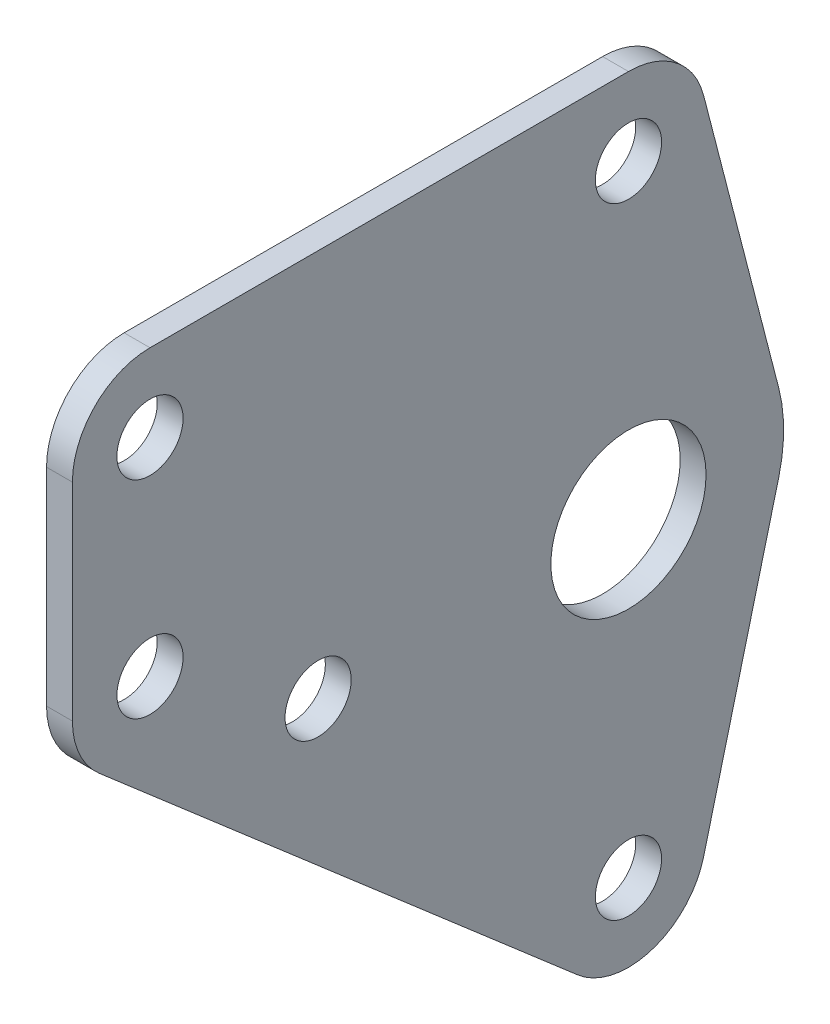
ISO-10303-21;
HEADER;
FILE_DESCRIPTION(('STEP AP214'),'2;1');
FILE_NAME('part.step','',(''),(''),'','','');
FILE_SCHEMA(('AUTOMOTIVE_DESIGN { 1 0 10303 214 1 1 1 1 }'));
ENDSEC;
DATA;
#1=APPLICATION_CONTEXT('core data for automotive mechanical design processes');
#2=APPLICATION_PROTOCOL_DEFINITION('international standard','automotive_design',2000,#1);
#3=PRODUCT_CONTEXT('',#1,'mechanical');
#4=PRODUCT('Part','Part','',(#3));
#5=PRODUCT_RELATED_PRODUCT_CATEGORY('part','',(#4));
#6=PRODUCT_DEFINITION_FORMATION('','',#4);
#7=PRODUCT_DEFINITION_CONTEXT('part definition',#1,'design');
#8=PRODUCT_DEFINITION('design','',#6,#7);
#9=PRODUCT_DEFINITION_SHAPE('','',#8);
#10=(LENGTH_UNIT() NAMED_UNIT(*) SI_UNIT(.MILLI.,.METRE.));
#11=(NAMED_UNIT(*) PLANE_ANGLE_UNIT() SI_UNIT($,.RADIAN.));
#12=(NAMED_UNIT(*) SI_UNIT($,.STERADIAN.) SOLID_ANGLE_UNIT());
#13=UNCERTAINTY_MEASURE_WITH_UNIT(LENGTH_MEASURE(1.E-05),#10,'distance_accuracy_value','');
#14=(GEOMETRIC_REPRESENTATION_CONTEXT(3) GLOBAL_UNCERTAINTY_ASSIGNED_CONTEXT((#13)) GLOBAL_UNIT_ASSIGNED_CONTEXT((#10,
#11,#12)) REPRESENTATION_CONTEXT('',''));
#15=CARTESIAN_POINT('',(0.,0.,0.));
#16=DIRECTION('',(0.,0.,1.));
#17=DIRECTION('',(1.,0.,0.));
#18=AXIS2_PLACEMENT_3D('',#15,#16,#17);
#19=CARTESIAN_POINT('',(1.5875,-19.05,0.));
#20=DIRECTION('',(-1.,0.,0.));
#21=DIRECTION('',(0.,0.,1.));
#22=AXIS2_PLACEMENT_3D('',#19,#20,#21);
#23=CYLINDRICAL_SURFACE('',#22,4.7625);
#24=DIRECTION('',(1.,0.,0.));
#25=VECTOR('',#24,1.);
#26=CARTESIAN_POINT('',(-57.6533492323841,-22.6521796088033,3.11539858058667));
#27=LINE('',#26,#25);
#28=CARTESIAN_POINT('',(0.,-22.6521796088033,3.11539858058667));
#29=VERTEX_POINT('',#28);
#30=CARTESIAN_POINT('',(1.5875,-22.6521796088033,3.11539858058667));
#31=VERTEX_POINT('',#30);
#32=EDGE_CURVE('E173',#29,#31,#27,.T.);
#33=ORIENTED_EDGE('',*,*,#32,.F.);
#34=CARTESIAN_POINT('',(0.,-19.05,0.));
#35=DIRECTION('',(1.,0.,0.));
#36=DIRECTION('',(0.,0.,1.));
#37=AXIS2_PLACEMENT_3D('',#34,#35,#36);
#38=CIRCLE('',#37,4.7625);
#39=CARTESIAN_POINT('',(0.,-20.240625,-4.61127079657821));
#40=VERTEX_POINT('',#39);
#41=EDGE_CURVE('E214',#29,#40,#38,.T.);
#42=ORIENTED_EDGE('',*,*,#41,.T.);
#43=DIRECTION('',(-1.,0.,0.));
#44=VECTOR('',#43,1.);
#45=CARTESIAN_POINT('',(1.5875,-20.240625,-4.61127079657821));
#46=LINE('',#45,#44);
#47=CARTESIAN_POINT('',(1.5875,-20.240625,-4.61127079657821));
#48=VERTEX_POINT('',#47);
#49=EDGE_CURVE('E11',#48,#40,#46,.T.);
#50=ORIENTED_EDGE('',*,*,#49,.F.);
#51=CARTESIAN_POINT('',(1.5875,-19.05,0.));
#52=DIRECTION('',(1.,0.,0.));
#53=DIRECTION('',(0.,0.,1.));
#54=AXIS2_PLACEMENT_3D('',#51,#52,#53);
#55=CIRCLE('',#54,4.7625);
#56=EDGE_CURVE('E99',#31,#48,#55,.T.);
#57=ORIENTED_EDGE('',*,*,#56,.F.);
#58=EDGE_LOOP('',(#33,#42,#50,#57));
#59=FACE_BOUND('',#58,.T.);
#60=ADVANCED_FACE('F44',(#59),#23,.T.);
#61=CARTESIAN_POINT('',(1.5875,-19.05,0.));
#62=DIRECTION('',(-1.,0.,0.));
#63=DIRECTION('',(0.,0.,1.));
#64=AXIS2_PLACEMENT_3D('',#61,#62,#63);
#65=PLANE('',#64);
#66=DIRECTION('',(0.,-0.654151932931584,-0.756363172452144));
#67=VECTOR('',#66,1.);
#68=CARTESIAN_POINT('',(1.5875,-22.6521796088033,3.11539858058667));
#69=LINE('',#68,#67);
#70=CARTESIAN_POINT('',(1.5875,2.74782039119666,32.4841485805867));
#71=VERTEX_POINT('',#70);
#72=EDGE_CURVE('E290',#71,#31,#69,.T.);
#73=ORIENTED_EDGE('',*,*,#72,.T.);
#74=ORIENTED_EDGE('',*,*,#56,.T.);
#75=DIRECTION('',(0.,0.968245836551854,-0.25));
#76=VECTOR('',#75,1.);
#77=CARTESIAN_POINT('',(1.5875,-2.38125,-9.22254159315641));
#78=LINE('',#77,#76);
#79=CARTESIAN_POINT('',(1.5875,-2.38125,-9.22254159315642));
#80=VERTEX_POINT('',#79);
#81=EDGE_CURVE('E219',#48,#80,#78,.T.);
#82=ORIENTED_EDGE('',*,*,#81,.T.);
#83=CARTESIAN_POINT('',(1.5875,0.,0.));
#84=DIRECTION('',(1.,0.,0.));
#85=DIRECTION('',(0.,0.,1.));
#86=AXIS2_PLACEMENT_3D('',#83,#84,#85);
#87=CIRCLE('',#86,9.525);
#88=CARTESIAN_POINT('',(1.5875,2.38125,-9.22254159315642));
#89=VERTEX_POINT('',#88);
#90=EDGE_CURVE('E221',#80,#89,#87,.T.);
#91=ORIENTED_EDGE('',*,*,#90,.T.);
#92=DIRECTION('',(0.,0.968245836551854,0.25));
#93=VECTOR('',#92,1.);
#94=CARTESIAN_POINT('',(1.5875,20.240625,-4.61127079657821));
#95=LINE('',#94,#93);
#96=CARTESIAN_POINT('',(1.5875,20.240625,-4.61127079657821));
#97=VERTEX_POINT('',#96);
#98=EDGE_CURVE('E72',#89,#97,#95,.T.);
#99=ORIENTED_EDGE('',*,*,#98,.T.);
#100=CARTESIAN_POINT('',(1.5875,19.05,0.));
#101=DIRECTION('',(1.,0.,0.));
#102=DIRECTION('',(0.,0.,1.));
#103=AXIS2_PLACEMENT_3D('',#100,#101,#102);
#104=CIRCLE('',#103,4.7625);
#105=CARTESIAN_POINT('',(1.5875,23.8125,0.));
#106=VERTEX_POINT('',#105);
#107=EDGE_CURVE('E229',#97,#106,#104,.T.);
#108=ORIENTED_EDGE('',*,*,#107,.T.);
#109=DIRECTION('',(0.,0.,1.));
#110=VECTOR('',#109,1.);
#111=CARTESIAN_POINT('',(1.5875,23.8125,29.36875));
#112=LINE('',#111,#110);
#113=CARTESIAN_POINT('',(1.5875,23.8125,29.36875));
#114=VERTEX_POINT('',#113);
#115=EDGE_CURVE('E56',#106,#114,#112,.T.);
#116=ORIENTED_EDGE('',*,*,#115,.T.);
#117=CARTESIAN_POINT('',(1.5875,19.05,29.36875));
#118=DIRECTION('',(1.,0.,0.));
#119=DIRECTION('',(0.,0.,-1.));
#120=AXIS2_PLACEMENT_3D('',#117,#118,#119);
#121=CIRCLE('',#120,4.7625);
#122=CARTESIAN_POINT('',(1.5875,19.05,34.13125));
#123=VERTEX_POINT('',#122);
#124=EDGE_CURVE('E160',#114,#123,#121,.T.);
#125=ORIENTED_EDGE('',*,*,#124,.T.);
#126=DIRECTION('',(0.,-1.,0.));
#127=VECTOR('',#126,1.);
#128=CARTESIAN_POINT('',(1.5875,6.35,34.13125));
#129=LINE('',#128,#127);
#130=CARTESIAN_POINT('',(1.5875,6.35,34.13125));
#131=VERTEX_POINT('',#130);
#132=EDGE_CURVE('E300',#123,#131,#129,.T.);
#133=ORIENTED_EDGE('',*,*,#132,.T.);
#134=CARTESIAN_POINT('',(1.5875,6.35,29.36875));
#135=DIRECTION('',(1.,0.,0.));
#136=DIRECTION('',(0.,0.,-1.));
#137=AXIS2_PLACEMENT_3D('',#134,#135,#136);
#138=CIRCLE('',#137,4.7625);
#139=EDGE_CURVE('E295',#131,#71,#138,.T.);
#140=ORIENTED_EDGE('',*,*,#139,.T.);
#141=EDGE_LOOP('',(#73,#74,#82,#91,#99,#108,#116,#125,#133,#140));
#142=FACE_BOUND('',#141,.T.);
#143=CARTESIAN_POINT('',(1.5875,0.,0.));
#144=DIRECTION('',(1.,0.,0.));
#145=DIRECTION('',(0.,0.,-1.));
#146=AXIS2_PLACEMENT_3D('',#143,#144,#145);
#147=CIRCLE('',#146,4.7625);
#148=CARTESIAN_POINT('',(1.5875,0.,-4.7625));
#149=VERTEX_POINT('',#148);
#150=EDGE_CURVE('E211',#149,#149,#147,.T.);
#151=ORIENTED_EDGE('',*,*,#150,.F.);
#152=EDGE_LOOP('',(#151));
#153=FACE_BOUND('',#152,.T.);
#154=CARTESIAN_POINT('',(1.5875,19.05,0.));
#155=DIRECTION('',(1.,0.,0.));
#156=DIRECTION('',(0.,0.,-1.));
#157=AXIS2_PLACEMENT_3D('',#154,#155,#156);
#158=CIRCLE('',#157,2.032);
#159=CARTESIAN_POINT('',(1.5875,19.05,-2.032));
#160=VERTEX_POINT('',#159);
#161=EDGE_CURVE('E204',#160,#160,#158,.T.);
#162=ORIENTED_EDGE('',*,*,#161,.F.);
#163=EDGE_LOOP('',(#162));
#164=FACE_BOUND('',#163,.T.);
#165=CARTESIAN_POINT('',(1.5875,0.,19.05));
#166=DIRECTION('',(1.,0.,0.));
#167=DIRECTION('',(0.,0.,-1.));
#168=AXIS2_PLACEMENT_3D('',#165,#166,#167);
#169=CIRCLE('',#168,2.032);
#170=CARTESIAN_POINT('',(1.5875,0.,17.018));
#171=VERTEX_POINT('',#170);
#172=EDGE_CURVE('E198',#171,#171,#169,.T.);
#173=ORIENTED_EDGE('',*,*,#172,.F.);
#174=EDGE_LOOP('',(#173));
#175=FACE_BOUND('',#174,.T.);
#176=CARTESIAN_POINT('',(1.5875,-19.05,0.));
#177=DIRECTION('',(1.,0.,0.));
#178=DIRECTION('',(0.,0.,-1.));
#179=AXIS2_PLACEMENT_3D('',#176,#177,#178);
#180=CIRCLE('',#179,2.032);
#181=CARTESIAN_POINT('',(1.5875,-19.05,-2.032));
#182=VERTEX_POINT('',#181);
#183=EDGE_CURVE('E189',#182,#182,#180,.T.);
#184=ORIENTED_EDGE('',*,*,#183,.F.);
#185=EDGE_LOOP('',(#184));
#186=FACE_BOUND('',#185,.T.);
#187=CARTESIAN_POINT('',(1.5875,19.05,29.36875));
#188=DIRECTION('',(1.,0.,0.));
#189=DIRECTION('',(0.,0.,-1.));
#190=AXIS2_PLACEMENT_3D('',#187,#188,#189);
#191=CIRCLE('',#190,2.032);
#192=CARTESIAN_POINT('',(1.5875,19.05,27.33675));
#193=VERTEX_POINT('',#192);
#194=EDGE_CURVE('E303',#193,#193,#191,.T.);
#195=ORIENTED_EDGE('',*,*,#194,.F.);
#196=EDGE_LOOP('',(#195));
#197=FACE_BOUND('',#196,.T.);
#198=CARTESIAN_POINT('',(1.5875,6.35,29.36875));
#199=DIRECTION('',(1.,0.,0.));
#200=DIRECTION('',(0.,0.,-1.));
#201=AXIS2_PLACEMENT_3D('',#198,#199,#200);
#202=CIRCLE('',#201,2.032);
#203=CARTESIAN_POINT('',(1.5875,6.35,27.33675));
#204=VERTEX_POINT('',#203);
#205=EDGE_CURVE('E158',#204,#204,#202,.T.);
#206=ORIENTED_EDGE('',*,*,#205,.F.);
#207=EDGE_LOOP('',(#206));
#208=FACE_BOUND('',#207,.T.);
#209=ADVANCED_FACE('F275',(#142,#153,#164,#175,#186,#197,#208),#65,.F.);
#210=CARTESIAN_POINT('',(0.,-19.05,0.));
#211=DIRECTION('',(-1.,0.,0.));
#212=DIRECTION('',(0.,0.,1.));
#213=AXIS2_PLACEMENT_3D('',#210,#211,#212);
#214=PLANE('',#213);
#215=ORIENTED_EDGE('',*,*,#41,.F.);
#216=DIRECTION('',(0.,-0.654151932931584,-0.756363172452144));
#217=VECTOR('',#216,1.);
#218=CARTESIAN_POINT('',(0.,-22.6521796088033,3.11539858058667));
#219=LINE('',#218,#217);
#220=CARTESIAN_POINT('',(0.,2.74782039119666,32.4841485805867));
#221=VERTEX_POINT('',#220);
#222=EDGE_CURVE('E175',#221,#29,#219,.T.);
#223=ORIENTED_EDGE('',*,*,#222,.F.);
#224=CARTESIAN_POINT('',(0.,6.35,29.36875));
#225=DIRECTION('',(-1.,0.,0.));
#226=DIRECTION('',(0.,0.,1.));
#227=AXIS2_PLACEMENT_3D('',#224,#225,#226);
#228=CIRCLE('',#227,4.7625);
#229=CARTESIAN_POINT('',(0.,6.35,34.13125));
#230=VERTEX_POINT('',#229);
#231=EDGE_CURVE('E177',#230,#221,#228,.F.);
#232=ORIENTED_EDGE('',*,*,#231,.F.);
#233=DIRECTION('',(0.,-1.,0.));
#234=VECTOR('',#233,1.);
#235=CARTESIAN_POINT('',(0.,6.35,34.13125));
#236=LINE('',#235,#234);
#237=CARTESIAN_POINT('',(0.,19.05,34.13125));
#238=VERTEX_POINT('',#237);
#239=EDGE_CURVE('E150',#238,#230,#236,.T.);
#240=ORIENTED_EDGE('',*,*,#239,.F.);
#241=CARTESIAN_POINT('',(0.,19.05,29.36875));
#242=DIRECTION('',(-1.,0.,0.));
#243=DIRECTION('',(0.,0.,1.));
#244=AXIS2_PLACEMENT_3D('',#241,#242,#243);
#245=CIRCLE('',#244,4.7625);
#246=CARTESIAN_POINT('',(0.,23.8125,29.36875));
#247=VERTEX_POINT('',#246);
#248=EDGE_CURVE('E138',#247,#238,#245,.F.);
#249=ORIENTED_EDGE('',*,*,#248,.F.);
#250=DIRECTION('',(0.,0.,1.));
#251=VECTOR('',#250,1.);
#252=CARTESIAN_POINT('',(0.,23.8125,29.36875));
#253=LINE('',#252,#251);
#254=CARTESIAN_POINT('',(0.,23.8125,0.));
#255=VERTEX_POINT('',#254);
#256=EDGE_CURVE('E144',#255,#247,#253,.T.);
#257=ORIENTED_EDGE('',*,*,#256,.F.);
#258=CARTESIAN_POINT('',(0.,19.05,0.));
#259=DIRECTION('',(1.,0.,0.));
#260=DIRECTION('',(0.,0.,1.));
#261=AXIS2_PLACEMENT_3D('',#258,#259,#260);
#262=CIRCLE('',#261,4.7625);
#263=CARTESIAN_POINT('',(0.,20.240625,-4.61127079657821));
#264=VERTEX_POINT('',#263);
#265=EDGE_CURVE('E222',#264,#255,#262,.T.);
#266=ORIENTED_EDGE('',*,*,#265,.F.);
#267=DIRECTION('',(0.,0.968245836551854,0.25));
#268=VECTOR('',#267,1.);
#269=CARTESIAN_POINT('',(0.,20.240625,-4.61127079657821));
#270=LINE('',#269,#268);
#271=CARTESIAN_POINT('',(0.,2.38125,-9.22254159315642));
#272=VERTEX_POINT('',#271);
#273=EDGE_CURVE('E91',#272,#264,#270,.T.);
#274=ORIENTED_EDGE('',*,*,#273,.F.);
#275=CARTESIAN_POINT('',(0.,0.,0.));
#276=DIRECTION('',(1.,0.,0.));
#277=DIRECTION('',(0.,0.,1.));
#278=AXIS2_PLACEMENT_3D('',#275,#276,#277);
#279=CIRCLE('',#278,9.525);
#280=CARTESIAN_POINT('',(0.,-2.38125,-9.22254159315642));
#281=VERTEX_POINT('',#280);
#282=EDGE_CURVE('E237',#281,#272,#279,.T.);
#283=ORIENTED_EDGE('',*,*,#282,.F.);
#284=DIRECTION('',(0.,0.968245836551854,-0.25));
#285=VECTOR('',#284,1.);
#286=CARTESIAN_POINT('',(0.,-2.38125,-9.22254159315641));
#287=LINE('',#286,#285);
#288=EDGE_CURVE('E233',#40,#281,#287,.T.);
#289=ORIENTED_EDGE('',*,*,#288,.F.);
#290=EDGE_LOOP('',(#215,#223,#232,#240,#249,#257,#266,#274,#283,#289));
#291=FACE_BOUND('',#290,.T.);
#292=CARTESIAN_POINT('',(0.,0.,19.05));
#293=DIRECTION('',(1.,0.,0.));
#294=DIRECTION('',(0.,0.,-1.));
#295=AXIS2_PLACEMENT_3D('',#292,#293,#294);
#296=CIRCLE('',#295,2.032);
#297=CARTESIAN_POINT('',(0.,0.,17.018));
#298=VERTEX_POINT('',#297);
#299=EDGE_CURVE('E192',#298,#298,#296,.T.);
#300=ORIENTED_EDGE('',*,*,#299,.T.);
#301=EDGE_LOOP('',(#300));
#302=FACE_BOUND('',#301,.T.);
#303=CARTESIAN_POINT('',(0.,0.,0.));
#304=DIRECTION('',(1.,0.,0.));
#305=DIRECTION('',(0.,0.,-1.));
#306=AXIS2_PLACEMENT_3D('',#303,#304,#305);
#307=CIRCLE('',#306,4.7625);
#308=CARTESIAN_POINT('',(0.,0.,-4.7625));
#309=VERTEX_POINT('',#308);
#310=EDGE_CURVE('E210',#309,#309,#307,.T.);
#311=ORIENTED_EDGE('',*,*,#310,.T.);
#312=EDGE_LOOP('',(#311));
#313=FACE_BOUND('',#312,.T.);
#314=CARTESIAN_POINT('',(0.,19.05,0.));
#315=DIRECTION('',(1.,0.,0.));
#316=DIRECTION('',(0.,0.,-1.));
#317=AXIS2_PLACEMENT_3D('',#314,#315,#316);
#318=CIRCLE('',#317,2.032);
#319=CARTESIAN_POINT('',(0.,19.05,-2.032));
#320=VERTEX_POINT('',#319);
#321=EDGE_CURVE('E199',#320,#320,#318,.T.);
#322=ORIENTED_EDGE('',*,*,#321,.T.);
#323=EDGE_LOOP('',(#322));
#324=FACE_BOUND('',#323,.T.);
#325=CARTESIAN_POINT('',(0.,-19.05,0.));
#326=DIRECTION('',(1.,0.,0.));
#327=DIRECTION('',(0.,0.,-1.));
#328=AXIS2_PLACEMENT_3D('',#325,#326,#327);
#329=CIRCLE('',#328,2.032);
#330=CARTESIAN_POINT('',(0.,-19.05,-2.032));
#331=VERTEX_POINT('',#330);
#332=EDGE_CURVE('E195',#331,#331,#329,.T.);
#333=ORIENTED_EDGE('',*,*,#332,.T.);
#334=EDGE_LOOP('',(#333));
#335=FACE_BOUND('',#334,.T.);
#336=CARTESIAN_POINT('',(0.,19.05,29.36875));
#337=DIRECTION('',(-1.,0.,0.));
#338=DIRECTION('',(0.,0.,1.));
#339=AXIS2_PLACEMENT_3D('',#336,#337,#338);
#340=CIRCLE('',#339,2.032);
#341=CARTESIAN_POINT('',(0.,19.05,31.40075));
#342=VERTEX_POINT('',#341);
#343=EDGE_CURVE('E168',#342,#342,#340,.F.);
#344=ORIENTED_EDGE('',*,*,#343,.T.);
#345=EDGE_LOOP('',(#344));
#346=FACE_BOUND('',#345,.T.);
#347=CARTESIAN_POINT('',(0.,6.35,29.36875));
#348=DIRECTION('',(-1.,0.,0.));
#349=DIRECTION('',(0.,0.,1.));
#350=AXIS2_PLACEMENT_3D('',#347,#348,#349);
#351=CIRCLE('',#350,2.032);
#352=CARTESIAN_POINT('',(0.,6.35,31.40075));
#353=VERTEX_POINT('',#352);
#354=EDGE_CURVE('E191',#353,#353,#351,.F.);
#355=ORIENTED_EDGE('',*,*,#354,.T.);
#356=EDGE_LOOP('',(#355));
#357=FACE_BOUND('',#356,.T.);
#358=ADVANCED_FACE('F143',(#291,#302,#313,#324,#335,#346,#357),#214,.T.);
#359=CARTESIAN_POINT('',(1.5875,-2.38125,-9.22254159315641));
#360=DIRECTION('',(0.,0.25,0.968245836551854));
#361=DIRECTION('',(0.,-0.968245836551854,0.25));
#362=AXIS2_PLACEMENT_3D('',#359,#360,#361);
#363=PLANE('',#362);
#364=ORIENTED_EDGE('',*,*,#288,.T.);
#365=DIRECTION('',(-1.,0.,0.));
#366=VECTOR('',#365,1.);
#367=CARTESIAN_POINT('',(1.5875,-2.38125,-9.22254159315642));
#368=LINE('',#367,#366);
#369=EDGE_CURVE('E55',#80,#281,#368,.T.);
#370=ORIENTED_EDGE('',*,*,#369,.F.);
#371=ORIENTED_EDGE('',*,*,#81,.F.);
#372=ORIENTED_EDGE('',*,*,#49,.T.);
#373=EDGE_LOOP('',(#364,#370,#371,#372));
#374=FACE_BOUND('',#373,.T.);
#375=ADVANCED_FACE('F267',(#374),#363,.F.);
#376=CARTESIAN_POINT('',(1.5875,0.,0.));
#377=DIRECTION('',(-1.,0.,0.));
#378=DIRECTION('',(0.,0.,1.));
#379=AXIS2_PLACEMENT_3D('',#376,#377,#378);
#380=CYLINDRICAL_SURFACE('',#379,9.525);
#381=ORIENTED_EDGE('',*,*,#282,.T.);
#382=DIRECTION('',(-1.,0.,0.));
#383=VECTOR('',#382,1.);
#384=CARTESIAN_POINT('',(1.5875,2.38125,-9.22254159315642));
#385=LINE('',#384,#383);
#386=EDGE_CURVE('E243',#89,#272,#385,.T.);
#387=ORIENTED_EDGE('',*,*,#386,.F.);
#388=ORIENTED_EDGE('',*,*,#90,.F.);
#389=ORIENTED_EDGE('',*,*,#369,.T.);
#390=EDGE_LOOP('',(#381,#387,#388,#389));
#391=FACE_BOUND('',#390,.T.);
#392=ADVANCED_FACE('F252',(#391),#380,.T.);
#393=CARTESIAN_POINT('',(1.5875,20.240625,-4.61127079657821));
#394=DIRECTION('',(0.,-0.25,0.968245836551854));
#395=DIRECTION('',(0.,-0.968245836551854,-0.25));
#396=AXIS2_PLACEMENT_3D('',#393,#394,#395);
#397=PLANE('',#396);
#398=ORIENTED_EDGE('',*,*,#273,.T.);
#399=DIRECTION('',(-1.,0.,0.));
#400=VECTOR('',#399,1.);
#401=CARTESIAN_POINT('',(1.5875,20.240625,-4.61127079657821));
#402=LINE('',#401,#400);
#403=EDGE_CURVE('E232',#97,#264,#402,.T.);
#404=ORIENTED_EDGE('',*,*,#403,.F.);
#405=ORIENTED_EDGE('',*,*,#98,.F.);
#406=ORIENTED_EDGE('',*,*,#386,.T.);
#407=EDGE_LOOP('',(#398,#404,#405,#406));
#408=FACE_BOUND('',#407,.T.);
#409=ADVANCED_FACE('F259',(#408),#397,.F.);
#410=CARTESIAN_POINT('',(1.5875,19.05,0.));
#411=DIRECTION('',(-1.,0.,0.));
#412=DIRECTION('',(0.,0.,1.));
#413=AXIS2_PLACEMENT_3D('',#410,#411,#412);
#414=CYLINDRICAL_SURFACE('',#413,4.7625);
#415=ORIENTED_EDGE('',*,*,#265,.T.);
#416=DIRECTION('',(1.,0.,0.));
#417=VECTOR('',#416,1.);
#418=CARTESIAN_POINT('',(-57.6533492323841,23.8125,0.));
#419=LINE('',#418,#417);
#420=EDGE_CURVE('E161',#255,#106,#419,.T.);
#421=ORIENTED_EDGE('',*,*,#420,.T.);
#422=ORIENTED_EDGE('',*,*,#107,.F.);
#423=ORIENTED_EDGE('',*,*,#403,.T.);
#424=EDGE_LOOP('',(#415,#421,#422,#423));
#425=FACE_BOUND('',#424,.T.);
#426=ADVANCED_FACE('F260',(#425),#414,.T.);
#427=CARTESIAN_POINT('',(1.5875,0.,0.));
#428=DIRECTION('',(-1.,0.,0.));
#429=DIRECTION('',(0.,0.,1.));
#430=AXIS2_PLACEMENT_3D('',#427,#428,#429);
#431=CYLINDRICAL_SURFACE('',#430,4.7625);
#432=ORIENTED_EDGE('',*,*,#150,.T.);
#433=EDGE_LOOP('',(#432));
#434=FACE_BOUND('',#433,.T.);
#435=ORIENTED_EDGE('',*,*,#310,.F.);
#436=EDGE_LOOP('',(#435));
#437=FACE_BOUND('',#436,.T.);
#438=ADVANCED_FACE('F270',(#434,#437),#431,.F.);
#439=CARTESIAN_POINT('',(1.5875,19.05,0.));
#440=DIRECTION('',(-1.,0.,0.));
#441=DIRECTION('',(0.,0.,1.));
#442=AXIS2_PLACEMENT_3D('',#439,#440,#441);
#443=CYLINDRICAL_SURFACE('',#442,2.032);
#444=ORIENTED_EDGE('',*,*,#161,.T.);
#445=EDGE_LOOP('',(#444));
#446=FACE_BOUND('',#445,.T.);
#447=ORIENTED_EDGE('',*,*,#321,.F.);
#448=EDGE_LOOP('',(#447));
#449=FACE_BOUND('',#448,.T.);
#450=ADVANCED_FACE('F338',(#446,#449),#443,.F.);
#451=CARTESIAN_POINT('',(1.5875,0.,19.05));
#452=DIRECTION('',(-1.,0.,0.));
#453=DIRECTION('',(0.,0.,1.));
#454=AXIS2_PLACEMENT_3D('',#451,#452,#453);
#455=CYLINDRICAL_SURFACE('',#454,2.032);
#456=ORIENTED_EDGE('',*,*,#172,.T.);
#457=EDGE_LOOP('',(#456));
#458=FACE_BOUND('',#457,.T.);
#459=ORIENTED_EDGE('',*,*,#299,.F.);
#460=EDGE_LOOP('',(#459));
#461=FACE_BOUND('',#460,.T.);
#462=ADVANCED_FACE('F337',(#458,#461),#455,.F.);
#463=CARTESIAN_POINT('',(1.5875,-19.05,0.));
#464=DIRECTION('',(-1.,0.,0.));
#465=DIRECTION('',(0.,0.,1.));
#466=AXIS2_PLACEMENT_3D('',#463,#464,#465);
#467=CYLINDRICAL_SURFACE('',#466,2.032);
#468=ORIENTED_EDGE('',*,*,#183,.T.);
#469=EDGE_LOOP('',(#468));
#470=FACE_BOUND('',#469,.T.);
#471=ORIENTED_EDGE('',*,*,#332,.F.);
#472=EDGE_LOOP('',(#471));
#473=FACE_BOUND('',#472,.T.);
#474=ADVANCED_FACE('F331',(#470,#473),#467,.F.);
#475=CARTESIAN_POINT('',(-57.6533492323841,-22.6521796088033,3.11539858058667));
#476=DIRECTION('',(0.,-0.756363172452144,0.654151932931584));
#477=DIRECTION('',(0.,-0.654151932931584,-0.756363172452144));
#478=AXIS2_PLACEMENT_3D('',#475,#476,#477);
#479=PLANE('',#478);
#480=DIRECTION('',(1.,0.,0.));
#481=VECTOR('',#480,1.);
#482=CARTESIAN_POINT('',(-57.6533492323841,2.74782039119666,32.4841485805867));
#483=LINE('',#482,#481);
#484=EDGE_CURVE('E176',#221,#71,#483,.T.);
#485=ORIENTED_EDGE('',*,*,#484,.F.);
#486=ORIENTED_EDGE('',*,*,#222,.T.);
#487=ORIENTED_EDGE('',*,*,#32,.T.);
#488=ORIENTED_EDGE('',*,*,#72,.F.);
#489=EDGE_LOOP('',(#485,#486,#487,#488));
#490=FACE_BOUND('',#489,.T.);
#491=ADVANCED_FACE('F287',(#490),#479,.T.);
#492=CARTESIAN_POINT('',(-57.6533492323841,6.35,29.36875));
#493=DIRECTION('',(1.,0.,0.));
#494=DIRECTION('',(0.,0.,-1.));
#495=AXIS2_PLACEMENT_3D('',#492,#493,#494);
#496=CYLINDRICAL_SURFACE('',#495,4.7625);
#497=DIRECTION('',(1.,0.,0.));
#498=VECTOR('',#497,1.);
#499=CARTESIAN_POINT('',(-57.6533492323841,6.35,34.13125));
#500=LINE('',#499,#498);
#501=EDGE_CURVE('E151',#230,#131,#500,.T.);
#502=ORIENTED_EDGE('',*,*,#501,.F.);
#503=ORIENTED_EDGE('',*,*,#231,.T.);
#504=ORIENTED_EDGE('',*,*,#484,.T.);
#505=ORIENTED_EDGE('',*,*,#139,.F.);
#506=EDGE_LOOP('',(#502,#503,#504,#505));
#507=FACE_BOUND('',#506,.T.);
#508=ADVANCED_FACE('F292',(#507),#496,.T.);
#509=CARTESIAN_POINT('',(-57.6533492323841,6.35,34.13125));
#510=DIRECTION('',(0.,0.,1.));
#511=DIRECTION('',(1.,0.,0.));
#512=AXIS2_PLACEMENT_3D('',#509,#510,#511);
#513=PLANE('',#512);
#514=DIRECTION('',(1.,0.,0.));
#515=VECTOR('',#514,1.);
#516=CARTESIAN_POINT('',(-57.6533492323841,19.05,34.13125));
#517=LINE('',#516,#515);
#518=EDGE_CURVE('E147',#238,#123,#517,.T.);
#519=ORIENTED_EDGE('',*,*,#518,.F.);
#520=ORIENTED_EDGE('',*,*,#239,.T.);
#521=ORIENTED_EDGE('',*,*,#501,.T.);
#522=ORIENTED_EDGE('',*,*,#132,.F.);
#523=EDGE_LOOP('',(#519,#520,#521,#522));
#524=FACE_BOUND('',#523,.T.);
#525=ADVANCED_FACE('F297',(#524),#513,.T.);
#526=CARTESIAN_POINT('',(-57.6533492323841,19.05,29.36875));
#527=DIRECTION('',(1.,0.,0.));
#528=DIRECTION('',(0.,0.,-1.));
#529=AXIS2_PLACEMENT_3D('',#526,#527,#528);
#530=CYLINDRICAL_SURFACE('',#529,4.7625);
#531=DIRECTION('',(1.,0.,0.));
#532=VECTOR('',#531,1.);
#533=CARTESIAN_POINT('',(-57.6533492323841,23.8125,29.36875));
#534=LINE('',#533,#532);
#535=EDGE_CURVE('E152',#247,#114,#534,.T.);
#536=ORIENTED_EDGE('',*,*,#535,.F.);
#537=ORIENTED_EDGE('',*,*,#248,.T.);
#538=ORIENTED_EDGE('',*,*,#518,.T.);
#539=ORIENTED_EDGE('',*,*,#124,.F.);
#540=EDGE_LOOP('',(#536,#537,#538,#539));
#541=FACE_BOUND('',#540,.T.);
#542=ADVANCED_FACE('F154',(#541),#530,.T.);
#543=CARTESIAN_POINT('',(-57.6533492323841,23.8125,29.36875));
#544=DIRECTION('',(0.,1.,0.));
#545=DIRECTION('',(0.,0.,1.));
#546=AXIS2_PLACEMENT_3D('',#543,#544,#545);
#547=PLANE('',#546);
#548=ORIENTED_EDGE('',*,*,#420,.F.);
#549=ORIENTED_EDGE('',*,*,#256,.T.);
#550=ORIENTED_EDGE('',*,*,#535,.T.);
#551=ORIENTED_EDGE('',*,*,#115,.F.);
#552=EDGE_LOOP('',(#548,#549,#550,#551));
#553=FACE_BOUND('',#552,.T.);
#554=ADVANCED_FACE('F159',(#553),#547,.T.);
#555=CARTESIAN_POINT('',(-57.6533492323841,6.35,29.36875));
#556=DIRECTION('',(1.,0.,0.));
#557=DIRECTION('',(0.,0.,-1.));
#558=AXIS2_PLACEMENT_3D('',#555,#556,#557);
#559=CYLINDRICAL_SURFACE('',#558,2.032);
#560=ORIENTED_EDGE('',*,*,#205,.T.);
#561=EDGE_LOOP('',(#560));
#562=FACE_BOUND('',#561,.T.);
#563=ORIENTED_EDGE('',*,*,#354,.F.);
#564=EDGE_LOOP('',(#563));
#565=FACE_BOUND('',#564,.T.);
#566=ADVANCED_FACE('F322',(#562,#565),#559,.F.);
#567=CARTESIAN_POINT('',(-57.6533492323841,19.05,29.36875));
#568=DIRECTION('',(1.,0.,0.));
#569=DIRECTION('',(0.,0.,-1.));
#570=AXIS2_PLACEMENT_3D('',#567,#568,#569);
#571=CYLINDRICAL_SURFACE('',#570,2.032);
#572=ORIENTED_EDGE('',*,*,#194,.T.);
#573=EDGE_LOOP('',(#572));
#574=FACE_BOUND('',#573,.T.);
#575=ORIENTED_EDGE('',*,*,#343,.F.);
#576=EDGE_LOOP('',(#575));
#577=FACE_BOUND('',#576,.T.);
#578=ADVANCED_FACE('F325',(#574,#577),#571,.F.);
#579=CLOSED_SHELL('',(#60,#209,#358,#375,#392,#409,#426,#438,#450,#462,#474,#491,#508,#525,#542,
#554,#566,#578));
#580=MANIFOLD_SOLID_BREP('B2',#579);
#581=ADVANCED_BREP_SHAPE_REPRESENTATION('',(#18,#580),#14);
#582=SHAPE_DEFINITION_REPRESENTATION(#9,#581);
ENDSEC;
END-ISO-10303-21;
